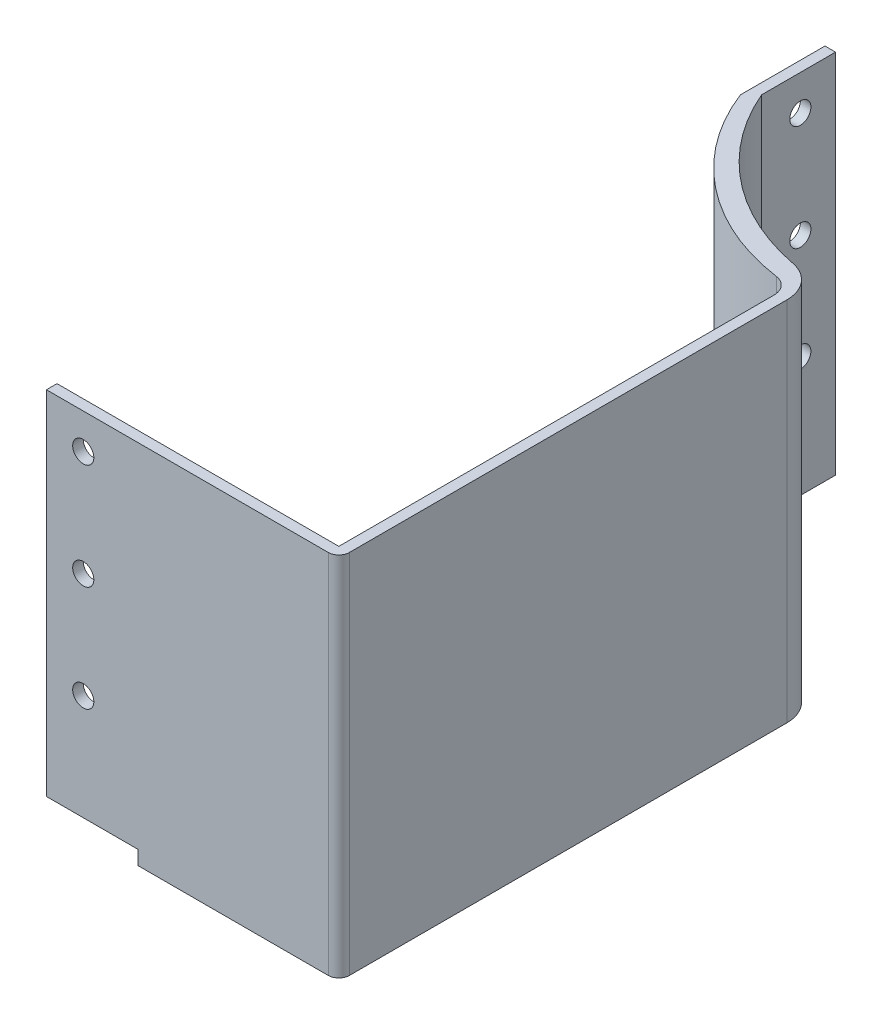
ISO-10303-21;
HEADER;
FILE_DESCRIPTION(('STEP AP214'),'2;1');
FILE_NAME('part.step','',(''),(''),'','','');
FILE_SCHEMA(('AUTOMOTIVE_DESIGN { 1 0 10303 214 1 1 1 1 }'));
ENDSEC;
DATA;
#1=APPLICATION_CONTEXT('core data for automotive mechanical design processes');
#2=APPLICATION_PROTOCOL_DEFINITION('international standard','automotive_design',2000,#1);
#3=PRODUCT_CONTEXT('',#1,'mechanical');
#4=PRODUCT('Part','Part','',(#3));
#5=PRODUCT_RELATED_PRODUCT_CATEGORY('part','',(#4));
#6=PRODUCT_DEFINITION_FORMATION('','',#4);
#7=PRODUCT_DEFINITION_CONTEXT('part definition',#1,'design');
#8=PRODUCT_DEFINITION('design','',#6,#7);
#9=PRODUCT_DEFINITION_SHAPE('','',#8);
#10=(LENGTH_UNIT() NAMED_UNIT(*) SI_UNIT(.MILLI.,.METRE.));
#11=(NAMED_UNIT(*) PLANE_ANGLE_UNIT() SI_UNIT($,.RADIAN.));
#12=(NAMED_UNIT(*) SI_UNIT($,.STERADIAN.) SOLID_ANGLE_UNIT());
#13=UNCERTAINTY_MEASURE_WITH_UNIT(LENGTH_MEASURE(1.E-05),#10,'distance_accuracy_value','');
#14=(GEOMETRIC_REPRESENTATION_CONTEXT(3) GLOBAL_UNCERTAINTY_ASSIGNED_CONTEXT((#13)) GLOBAL_UNIT_ASSIGNED_CONTEXT((#10,
#11,#12)) REPRESENTATION_CONTEXT('',''));
#15=CARTESIAN_POINT('',(0.,0.,0.));
#16=DIRECTION('',(0.,0.,1.));
#17=DIRECTION('',(1.,0.,0.));
#18=AXIS2_PLACEMENT_3D('',#15,#16,#17);
#19=CARTESIAN_POINT('',(58.5616033549649,-100.,-174.880780034734));
#20=DIRECTION('',(0.,1.,0.));
#21=DIRECTION('',(0.,0.,1.));
#22=AXIS2_PLACEMENT_3D('',#19,#20,#21);
#23=CYLINDRICAL_SURFACE('',#22,62.7741227806787);
#24=CARTESIAN_POINT('',(58.5616033549649,-100.,-174.880780034734));
#25=DIRECTION('',(0.,1.,0.));
#26=DIRECTION('',(0.,0.,-1.));
#27=AXIS2_PLACEMENT_3D('',#24,#25,#26);
#28=CIRCLE('',#27,62.7741227806787);
#29=CARTESIAN_POINT('',(0.,-100.,-152.272615505532));
#30=VERTEX_POINT('',#29);
#31=CARTESIAN_POINT('',(49.7054022215755,-100.,-112.734515526168));
#32=VERTEX_POINT('',#31);
#33=EDGE_CURVE('E237',#30,#32,#28,.T.);
#34=ORIENTED_EDGE('',*,*,#33,.T.);
#35=DIRECTION('',(0.,1.,0.));
#36=VECTOR('',#35,1.);
#37=CARTESIAN_POINT('',(49.7054022215755,-100.,-112.734515526168));
#38=LINE('',#37,#36);
#39=CARTESIAN_POINT('',(49.7054022215755,0.,-112.734515526168));
#40=VERTEX_POINT('',#39);
#41=EDGE_CURVE('E330',#32,#40,#38,.T.);
#42=ORIENTED_EDGE('',*,*,#41,.T.);
#43=CARTESIAN_POINT('',(58.5616033549649,0.,-174.880780034734));
#44=DIRECTION('',(0.,1.,0.));
#45=DIRECTION('',(0.,0.,-1.));
#46=AXIS2_PLACEMENT_3D('',#43,#44,#45);
#47=CIRCLE('',#46,62.7741227806787);
#48=CARTESIAN_POINT('',(0.,0.,-152.272615505532));
#49=VERTEX_POINT('',#48);
#50=EDGE_CURVE('E259',#49,#40,#47,.T.);
#51=ORIENTED_EDGE('',*,*,#50,.F.);
#52=DIRECTION('',(0.,1.,0.));
#53=VECTOR('',#52,1.);
#54=CARTESIAN_POINT('',(0.,-100.,-152.272615505532));
#55=LINE('',#54,#53);
#56=EDGE_CURVE('E153',#30,#49,#55,.T.);
#57=ORIENTED_EDGE('',*,*,#56,.F.);
#58=EDGE_LOOP('',(#34,#42,#51,#57));
#59=FACE_BOUND('',#58,.T.);
#60=ADVANCED_FACE('F39',(#59),#23,.T.);
#61=CARTESIAN_POINT('',(0.,-100.,-152.272615505532));
#62=DIRECTION('',(-1.,0.,0.));
#63=DIRECTION('',(0.,0.,1.));
#64=AXIS2_PLACEMENT_3D('',#61,#62,#63);
#65=PLANE('',#64);
#66=CARTESIAN_POINT('',(0.,-70.,-166.272615505532));
#67=DIRECTION('',(-1.,0.,0.));
#68=DIRECTION('',(0.,0.,1.));
#69=AXIS2_PLACEMENT_3D('',#66,#67,#68);
#70=CIRCLE('',#69,2.99999999999999);
#71=CARTESIAN_POINT('',(0.,-70.,-163.272615505532));
#72=VERTEX_POINT('',#71);
#73=EDGE_CURVE('E220',#72,#72,#70,.T.);
#74=ORIENTED_EDGE('',*,*,#73,.F.);
#75=EDGE_LOOP('',(#74));
#76=FACE_BOUND('',#75,.T.);
#77=CARTESIAN_POINT('',(0.,-40.,-166.272615505532));
#78=DIRECTION('',(-1.,0.,0.));
#79=DIRECTION('',(0.,0.,1.));
#80=AXIS2_PLACEMENT_3D('',#77,#78,#79);
#81=CIRCLE('',#80,2.99999999999999);
#82=CARTESIAN_POINT('',(0.,-40.,-163.272615505532));
#83=VERTEX_POINT('',#82);
#84=EDGE_CURVE('E216',#83,#83,#81,.T.);
#85=ORIENTED_EDGE('',*,*,#84,.F.);
#86=EDGE_LOOP('',(#85));
#87=FACE_BOUND('',#86,.T.);
#88=CARTESIAN_POINT('',(0.,-9.99999999999999,-166.272615505532));
#89=DIRECTION('',(-1.,0.,0.));
#90=DIRECTION('',(0.,0.,1.));
#91=AXIS2_PLACEMENT_3D('',#88,#89,#90);
#92=CIRCLE('',#91,2.99999999999999);
#93=CARTESIAN_POINT('',(0.,-9.99999999999999,-163.272615505532));
#94=VERTEX_POINT('',#93);
#95=EDGE_CURVE('E205',#94,#94,#92,.T.);
#96=ORIENTED_EDGE('',*,*,#95,.F.);
#97=EDGE_LOOP('',(#96));
#98=FACE_BOUND('',#97,.T.);
#99=DIRECTION('',(0.,0.,1.));
#100=VECTOR('',#99,1.);
#101=CARTESIAN_POINT('',(0.,0.,-152.272615505532));
#102=LINE('',#101,#100);
#103=CARTESIAN_POINT('',(0.,0.,-176.272615505532));
#104=VERTEX_POINT('',#103);
#105=EDGE_CURVE('E148',#104,#49,#102,.T.);
#106=ORIENTED_EDGE('',*,*,#105,.F.);
#107=DIRECTION('',(0.,1.,0.));
#108=VECTOR('',#107,1.);
#109=CARTESIAN_POINT('',(0.,-100.,-176.272615505532));
#110=LINE('',#109,#108);
#111=CARTESIAN_POINT('',(0.,-104.,-176.272615505532));
#112=VERTEX_POINT('',#111);
#113=EDGE_CURVE('E142',#112,#104,#110,.T.);
#114=ORIENTED_EDGE('',*,*,#113,.F.);
#115=DIRECTION('',(0.,0.,-1.));
#116=VECTOR('',#115,1.);
#117=CARTESIAN_POINT('',(0.,-104.,-176.272615505532));
#118=LINE('',#117,#116);
#119=CARTESIAN_POINT('',(0.,-104.,18.7273844944685));
#120=VERTEX_POINT('',#119);
#121=EDGE_CURVE('E146',#120,#112,#118,.T.);
#122=ORIENTED_EDGE('',*,*,#121,.F.);
#123=DIRECTION('',(0.,1.,0.));
#124=VECTOR('',#123,1.);
#125=CARTESIAN_POINT('',(0.,-104.,18.7273844944685));
#126=LINE('',#125,#124);
#127=CARTESIAN_POINT('',(0.,-100.,18.7273844944685));
#128=VERTEX_POINT('',#127);
#129=EDGE_CURVE('E196',#120,#128,#126,.T.);
#130=ORIENTED_EDGE('',*,*,#129,.T.);
#131=DIRECTION('',(0.,0.,-1.));
#132=VECTOR('',#131,1.);
#133=CARTESIAN_POINT('',(0.,-100.,-176.272615505532));
#134=LINE('',#133,#132);
#135=CARTESIAN_POINT('',(0.,-100.,15.7273844944684));
#136=VERTEX_POINT('',#135);
#137=EDGE_CURVE('E171',#128,#136,#134,.T.);
#138=ORIENTED_EDGE('',*,*,#137,.T.);
#139=EDGE_CURVE('E175',#136,#30,#134,.T.);
#140=ORIENTED_EDGE('',*,*,#139,.T.);
#141=ORIENTED_EDGE('',*,*,#56,.T.);
#142=EDGE_LOOP('',(#106,#114,#122,#130,#138,#140,#141));
#143=FACE_BOUND('',#142,.T.);
#144=ADVANCED_FACE('F144',(#76,#87,#98,#143),#65,.T.);
#145=CARTESIAN_POINT('',(0.,-100.,-176.272615505532));
#146=DIRECTION('',(0.,0.,-1.));
#147=DIRECTION('',(-1.,0.,0.));
#148=AXIS2_PLACEMENT_3D('',#145,#146,#147);
#149=PLANE('',#148);
#150=DIRECTION('',(-1.,0.,0.));
#151=VECTOR('',#150,1.);
#152=CARTESIAN_POINT('',(0.,0.,-176.272615505532));
#153=LINE('',#152,#151);
#154=CARTESIAN_POINT('',(3.,0.,-176.272615505532));
#155=VERTEX_POINT('',#154);
#156=EDGE_CURVE('E288',#155,#104,#153,.T.);
#157=ORIENTED_EDGE('',*,*,#156,.F.);
#158=DIRECTION('',(0.,1.,0.));
#159=VECTOR('',#158,1.);
#160=CARTESIAN_POINT('',(3.,-100.,-176.272615505532));
#161=LINE('',#160,#159);
#162=CARTESIAN_POINT('',(3.,-104.,-176.272615505532));
#163=VERTEX_POINT('',#162);
#164=EDGE_CURVE('E154',#163,#155,#161,.T.);
#165=ORIENTED_EDGE('',*,*,#164,.F.);
#166=DIRECTION('',(1.,0.,0.));
#167=VECTOR('',#166,1.);
#168=CARTESIAN_POINT('',(3.,-104.,-176.272615505532));
#169=LINE('',#168,#167);
#170=EDGE_CURVE('E157',#112,#163,#169,.T.);
#171=ORIENTED_EDGE('',*,*,#170,.F.);
#172=ORIENTED_EDGE('',*,*,#113,.T.);
#173=EDGE_LOOP('',(#157,#165,#171,#172));
#174=FACE_BOUND('',#173,.T.);
#175=ADVANCED_FACE('F158',(#174),#149,.T.);
#176=CARTESIAN_POINT('',(3.,-100.,-176.272615505532));
#177=DIRECTION('',(1.,0.,0.));
#178=DIRECTION('',(0.,0.,-1.));
#179=AXIS2_PLACEMENT_3D('',#176,#177,#178);
#180=PLANE('',#179);
#181=CARTESIAN_POINT('',(3.,-70.,-166.272615505532));
#182=DIRECTION('',(1.,0.,0.));
#183=DIRECTION('',(0.,0.,-1.));
#184=AXIS2_PLACEMENT_3D('',#181,#182,#183);
#185=CIRCLE('',#184,2.99999999999999);
#186=CARTESIAN_POINT('',(3.,-70.,-169.272615505532));
#187=VERTEX_POINT('',#186);
#188=EDGE_CURVE('E201',#187,#187,#185,.T.);
#189=ORIENTED_EDGE('',*,*,#188,.F.);
#190=EDGE_LOOP('',(#189));
#191=FACE_BOUND('',#190,.T.);
#192=CARTESIAN_POINT('',(3.,-40.,-166.272615505532));
#193=DIRECTION('',(1.,0.,0.));
#194=DIRECTION('',(0.,0.,-1.));
#195=AXIS2_PLACEMENT_3D('',#192,#193,#194);
#196=CIRCLE('',#195,2.99999999999999);
#197=CARTESIAN_POINT('',(3.,-40.,-169.272615505532));
#198=VERTEX_POINT('',#197);
#199=EDGE_CURVE('E206',#198,#198,#196,.T.);
#200=ORIENTED_EDGE('',*,*,#199,.F.);
#201=EDGE_LOOP('',(#200));
#202=FACE_BOUND('',#201,.T.);
#203=CARTESIAN_POINT('',(3.,-9.99999999999999,-166.272615505532));
#204=DIRECTION('',(1.,0.,0.));
#205=DIRECTION('',(0.,0.,-1.));
#206=AXIS2_PLACEMENT_3D('',#203,#204,#205);
#207=CIRCLE('',#206,2.99999999999999);
#208=CARTESIAN_POINT('',(3.,-9.99999999999999,-169.272615505532));
#209=VERTEX_POINT('',#208);
#210=EDGE_CURVE('E200',#209,#209,#207,.T.);
#211=ORIENTED_EDGE('',*,*,#210,.F.);
#212=EDGE_LOOP('',(#211));
#213=FACE_BOUND('',#212,.T.);
#214=DIRECTION('',(0.,0.,-1.));
#215=VECTOR('',#214,1.);
#216=CARTESIAN_POINT('',(3.,0.,-176.272615505532));
#217=LINE('',#216,#215);
#218=CARTESIAN_POINT('',(3.,0.,-155.272615505532));
#219=VERTEX_POINT('',#218);
#220=EDGE_CURVE('E284',#219,#155,#217,.T.);
#221=ORIENTED_EDGE('',*,*,#220,.F.);
#222=DIRECTION('',(0.,1.,0.));
#223=VECTOR('',#222,1.);
#224=CARTESIAN_POINT('',(3.,-100.,-155.272615505532));
#225=LINE('',#224,#223);
#226=CARTESIAN_POINT('',(3.,-104.,-155.272615505532));
#227=VERTEX_POINT('',#226);
#228=EDGE_CURVE('E298',#227,#219,#225,.T.);
#229=ORIENTED_EDGE('',*,*,#228,.F.);
#230=DIRECTION('',(0.,0.,1.));
#231=VECTOR('',#230,1.);
#232=CARTESIAN_POINT('',(3.,-104.,-155.272615505532));
#233=LINE('',#232,#231);
#234=EDGE_CURVE('E163',#163,#227,#233,.T.);
#235=ORIENTED_EDGE('',*,*,#234,.F.);
#236=ORIENTED_EDGE('',*,*,#164,.T.);
#237=EDGE_LOOP('',(#221,#229,#235,#236));
#238=FACE_BOUND('',#237,.T.);
#239=ADVANCED_FACE('F379',(#191,#202,#213,#238),#180,.T.);
#240=CARTESIAN_POINT('',(60.7261232311468,-100.,-179.936053781372));
#241=DIRECTION('',(0.,1.,0.));
#242=DIRECTION('',(0.,0.,1.));
#243=AXIS2_PLACEMENT_3D('',#240,#241,#242);
#244=CYLINDRICAL_SURFACE('',#243,62.7741227806788);
#245=CARTESIAN_POINT('',(60.7261232311468,0.,-179.936053781372));
#246=DIRECTION('',(0.,-1.,0.));
#247=DIRECTION('',(0.,0.,-1.));
#248=AXIS2_PLACEMENT_3D('',#245,#246,#247);
#249=CIRCLE('',#248,62.7741227806788);
#250=CARTESIAN_POINT('',(48.8861269235101,0.,-118.288629031275));
#251=VERTEX_POINT('',#250);
#252=EDGE_CURVE('E281',#251,#219,#249,.T.);
#253=ORIENTED_EDGE('',*,*,#252,.F.);
#254=DIRECTION('',(0.,1.,0.));
#255=VECTOR('',#254,1.);
#256=CARTESIAN_POINT('',(48.8861269235101,-100.,-118.288629031275));
#257=LINE('',#256,#255);
#258=CARTESIAN_POINT('',(48.8861269235101,-104.,-118.288629031275));
#259=VERTEX_POINT('',#258);
#260=EDGE_CURVE('E317',#251,#259,#257,.F.);
#261=ORIENTED_EDGE('',*,*,#260,.T.);
#262=CARTESIAN_POINT('',(60.7261232311468,-104.,-179.936053781372));
#263=DIRECTION('',(0.,1.,0.));
#264=DIRECTION('',(0.,0.,1.));
#265=AXIS2_PLACEMENT_3D('',#262,#263,#264);
#266=CIRCLE('',#265,62.7741227806788);
#267=EDGE_CURVE('E180',#227,#259,#266,.T.);
#268=ORIENTED_EDGE('',*,*,#267,.F.);
#269=ORIENTED_EDGE('',*,*,#228,.T.);
#270=EDGE_LOOP('',(#253,#261,#268,#269));
#271=FACE_BOUND('',#270,.T.);
#272=ADVANCED_FACE('F383',(#271),#244,.F.);
#273=CARTESIAN_POINT('',(57.,-100.,-117.272615505532));
#274=DIRECTION('',(1.,0.,0.));
#275=DIRECTION('',(0.,0.,-1.));
#276=AXIS2_PLACEMENT_3D('',#273,#274,#275);
#277=PLANE('',#276);
#278=DIRECTION('',(0.,0.,-1.));
#279=VECTOR('',#278,1.);
#280=CARTESIAN_POINT('',(57.,0.,-117.272615505532));
#281=LINE('',#280,#279);
#282=CARTESIAN_POINT('',(57.,0.,15.7273844944684));
#283=VERTEX_POINT('',#282);
#284=CARTESIAN_POINT('',(57.,0.,-108.468113503645));
#285=VERTEX_POINT('',#284);
#286=EDGE_CURVE('E278',#283,#285,#281,.T.);
#287=ORIENTED_EDGE('',*,*,#286,.F.);
#288=DIRECTION('',(0.,1.,0.));
#289=VECTOR('',#288,1.);
#290=CARTESIAN_POINT('',(57.,-100.,15.7273844944684));
#291=LINE('',#290,#289);
#292=CARTESIAN_POINT('',(57.,-104.,15.7273844944684));
#293=VERTEX_POINT('',#292);
#294=EDGE_CURVE('E327',#283,#293,#291,.F.);
#295=ORIENTED_EDGE('',*,*,#294,.T.);
#296=DIRECTION('',(0.,0.,1.));
#297=VECTOR('',#296,1.);
#298=CARTESIAN_POINT('',(57.,-104.,15.7273844944684));
#299=LINE('',#298,#297);
#300=CARTESIAN_POINT('',(57.,-104.,-108.468113503645));
#301=VERTEX_POINT('',#300);
#302=EDGE_CURVE('E188',#301,#293,#299,.T.);
#303=ORIENTED_EDGE('',*,*,#302,.F.);
#304=DIRECTION('',(0.,1.,0.));
#305=VECTOR('',#304,1.);
#306=CARTESIAN_POINT('',(57.,-100.,-108.468113503645));
#307=LINE('',#306,#305);
#308=EDGE_CURVE('E294',#301,#285,#307,.T.);
#309=ORIENTED_EDGE('',*,*,#308,.T.);
#310=EDGE_LOOP('',(#287,#295,#303,#309));
#311=FACE_BOUND('',#310,.T.);
#312=ADVANCED_FACE('F392',(#311),#277,.T.);
#313=CARTESIAN_POINT('',(57.,-100.,18.7273844944684));
#314=DIRECTION('',(0.,0.,1.));
#315=DIRECTION('',(1.,0.,0.));
#316=AXIS2_PLACEMENT_3D('',#313,#314,#315);
#317=PLANE('',#316);
#318=CARTESIAN_POINT('',(-15.5536016769738,-10.,18.7273844944685));
#319=DIRECTION('',(0.,0.,1.));
#320=DIRECTION('',(1.,0.,0.));
#321=AXIS2_PLACEMENT_3D('',#318,#319,#320);
#322=CIRCLE('',#321,3.00000000000001);
#323=CARTESIAN_POINT('',(-12.5536016769737,-10.,18.7273844944685));
#324=VERTEX_POINT('',#323);
#325=EDGE_CURVE('E225',#324,#324,#322,.T.);
#326=ORIENTED_EDGE('',*,*,#325,.F.);
#327=EDGE_LOOP('',(#326));
#328=FACE_BOUND('',#327,.T.);
#329=CARTESIAN_POINT('',(-15.5536016769734,-40.,18.7273844944685));
#330=DIRECTION('',(0.,0.,1.));
#331=DIRECTION('',(1.,0.,0.));
#332=AXIS2_PLACEMENT_3D('',#329,#330,#331);
#333=CIRCLE('',#332,3.00000000000001);
#334=CARTESIAN_POINT('',(-12.5536016769734,-40.,18.7273844944685));
#335=VERTEX_POINT('',#334);
#336=EDGE_CURVE('E230',#335,#335,#333,.T.);
#337=ORIENTED_EDGE('',*,*,#336,.F.);
#338=EDGE_LOOP('',(#337));
#339=FACE_BOUND('',#338,.T.);
#340=CARTESIAN_POINT('',(-15.5536016769731,-70.,18.7273844944685));
#341=DIRECTION('',(0.,0.,1.));
#342=DIRECTION('',(1.,0.,0.));
#343=AXIS2_PLACEMENT_3D('',#340,#341,#342);
#344=CIRCLE('',#343,3.00000000000001);
#345=CARTESIAN_POINT('',(-12.5536016769731,-70.,18.7273844944685));
#346=VERTEX_POINT('',#345);
#347=EDGE_CURVE('E224',#346,#346,#344,.T.);
#348=ORIENTED_EDGE('',*,*,#347,.F.);
#349=EDGE_LOOP('',(#348));
#350=FACE_BOUND('',#349,.T.);
#351=DIRECTION('',(1.,0.,0.));
#352=VECTOR('',#351,1.);
#353=CARTESIAN_POINT('',(57.,-100.,18.7273844944684));
#354=LINE('',#353,#352);
#355=CARTESIAN_POINT('',(-26.,-100.,18.7273844944685));
#356=VERTEX_POINT('',#355);
#357=EDGE_CURVE('E254',#356,#128,#354,.T.);
#358=ORIENTED_EDGE('',*,*,#357,.T.);
#359=ORIENTED_EDGE('',*,*,#129,.F.);
#360=DIRECTION('',(-1.,0.,0.));
#361=VECTOR('',#360,1.);
#362=CARTESIAN_POINT('',(0.,-104.,18.7273844944685));
#363=LINE('',#362,#361);
#364=CARTESIAN_POINT('',(54.,-104.,18.7273844944685));
#365=VERTEX_POINT('',#364);
#366=EDGE_CURVE('E168',#365,#120,#363,.T.);
#367=ORIENTED_EDGE('',*,*,#366,.F.);
#368=DIRECTION('',(0.,1.,0.));
#369=VECTOR('',#368,1.);
#370=CARTESIAN_POINT('',(54.,-100.,18.7273844944684));
#371=LINE('',#370,#369);
#372=CARTESIAN_POINT('',(54.,0.,18.7273844944684));
#373=VERTEX_POINT('',#372);
#374=EDGE_CURVE('E320',#365,#373,#371,.T.);
#375=ORIENTED_EDGE('',*,*,#374,.T.);
#376=DIRECTION('',(1.,0.,0.));
#377=VECTOR('',#376,1.);
#378=CARTESIAN_POINT('',(57.,0.,18.7273844944684));
#379=LINE('',#378,#377);
#380=CARTESIAN_POINT('',(-26.,0.,18.7273844944685));
#381=VERTEX_POINT('',#380);
#382=EDGE_CURVE('E274',#381,#373,#379,.T.);
#383=ORIENTED_EDGE('',*,*,#382,.F.);
#384=DIRECTION('',(0.,1.,0.));
#385=VECTOR('',#384,1.);
#386=CARTESIAN_POINT('',(-26.,-100.,18.7273844944685));
#387=LINE('',#386,#385);
#388=EDGE_CURVE('E302',#356,#381,#387,.T.);
#389=ORIENTED_EDGE('',*,*,#388,.F.);
#390=EDGE_LOOP('',(#358,#359,#367,#375,#383,#389));
#391=FACE_BOUND('',#390,.T.);
#392=ADVANCED_FACE('F363',(#328,#339,#350,#391),#317,.T.);
#393=CARTESIAN_POINT('',(-26.,-100.,18.7273844944685));
#394=DIRECTION('',(-1.,0.,0.));
#395=DIRECTION('',(0.,0.,1.));
#396=AXIS2_PLACEMENT_3D('',#393,#394,#395);
#397=PLANE('',#396);
#398=DIRECTION('',(0.,0.,1.));
#399=VECTOR('',#398,1.);
#400=CARTESIAN_POINT('',(-26.,0.,18.7273844944685));
#401=LINE('',#400,#399);
#402=CARTESIAN_POINT('',(-26.,0.,15.7273844944684));
#403=VERTEX_POINT('',#402);
#404=EDGE_CURVE('E270',#403,#381,#401,.T.);
#405=ORIENTED_EDGE('',*,*,#404,.F.);
#406=DIRECTION('',(0.,1.,0.));
#407=VECTOR('',#406,1.);
#408=CARTESIAN_POINT('',(-26.,-100.,15.7273844944684));
#409=LINE('',#408,#407);
#410=CARTESIAN_POINT('',(-26.,-100.,15.7273844944684));
#411=VERTEX_POINT('',#410);
#412=EDGE_CURVE('E305',#411,#403,#409,.T.);
#413=ORIENTED_EDGE('',*,*,#412,.F.);
#414=DIRECTION('',(0.,0.,1.));
#415=VECTOR('',#414,1.);
#416=CARTESIAN_POINT('',(-26.,-100.,18.7273844944685));
#417=LINE('',#416,#415);
#418=EDGE_CURVE('E250',#411,#356,#417,.T.);
#419=ORIENTED_EDGE('',*,*,#418,.T.);
#420=ORIENTED_EDGE('',*,*,#388,.T.);
#421=EDGE_LOOP('',(#405,#413,#419,#420));
#422=FACE_BOUND('',#421,.T.);
#423=ADVANCED_FACE('F359',(#422),#397,.T.);
#424=CARTESIAN_POINT('',(-26.,-100.,15.7273844944684));
#425=DIRECTION('',(0.,0.,-1.));
#426=DIRECTION('',(-1.,0.,0.));
#427=AXIS2_PLACEMENT_3D('',#424,#425,#426);
#428=PLANE('',#427);
#429=CARTESIAN_POINT('',(-15.5536016769738,-10.,15.7273844944684));
#430=DIRECTION('',(0.,0.,-1.));
#431=DIRECTION('',(-1.,0.,0.));
#432=AXIS2_PLACEMENT_3D('',#429,#430,#431);
#433=CIRCLE('',#432,3.00000000000001);
#434=CARTESIAN_POINT('',(-18.5536016769738,-10.,15.7273844944684));
#435=VERTEX_POINT('',#434);
#436=EDGE_CURVE('E263',#435,#435,#433,.T.);
#437=ORIENTED_EDGE('',*,*,#436,.F.);
#438=EDGE_LOOP('',(#437));
#439=FACE_BOUND('',#438,.T.);
#440=CARTESIAN_POINT('',(-15.5536016769734,-40.,15.7273844944684));
#441=DIRECTION('',(0.,0.,-1.));
#442=DIRECTION('',(-1.,0.,0.));
#443=AXIS2_PLACEMENT_3D('',#440,#441,#442);
#444=CIRCLE('',#443,3.00000000000001);
#445=CARTESIAN_POINT('',(-18.5536016769735,-40.,15.7273844944684));
#446=VERTEX_POINT('',#445);
#447=EDGE_CURVE('E334',#446,#446,#444,.T.);
#448=ORIENTED_EDGE('',*,*,#447,.F.);
#449=EDGE_LOOP('',(#448));
#450=FACE_BOUND('',#449,.T.);
#451=CARTESIAN_POINT('',(-15.5536016769731,-70.,15.7273844944684));
#452=DIRECTION('',(0.,0.,-1.));
#453=DIRECTION('',(-1.,0.,0.));
#454=AXIS2_PLACEMENT_3D('',#451,#452,#453);
#455=CIRCLE('',#454,3.00000000000001);
#456=CARTESIAN_POINT('',(-18.5536016769731,-70.,15.7273844944684));
#457=VERTEX_POINT('',#456);
#458=EDGE_CURVE('E229',#457,#457,#455,.T.);
#459=ORIENTED_EDGE('',*,*,#458,.F.);
#460=EDGE_LOOP('',(#459));
#461=FACE_BOUND('',#460,.T.);
#462=DIRECTION('',(-1.,0.,0.));
#463=VECTOR('',#462,1.);
#464=CARTESIAN_POINT('',(-26.,0.,15.7273844944684));
#465=LINE('',#464,#463);
#466=CARTESIAN_POINT('',(54.,0.,15.7273844944684));
#467=VERTEX_POINT('',#466);
#468=EDGE_CURVE('E266',#467,#403,#465,.T.);
#469=ORIENTED_EDGE('',*,*,#468,.F.);
#470=DIRECTION('',(0.,1.,0.));
#471=VECTOR('',#470,1.);
#472=CARTESIAN_POINT('',(54.,-100.,15.7273844944684));
#473=LINE('',#472,#471);
#474=CARTESIAN_POINT('',(54.,-100.,15.7273844944684));
#475=VERTEX_POINT('',#474);
#476=EDGE_CURVE('E258',#475,#467,#473,.T.);
#477=ORIENTED_EDGE('',*,*,#476,.F.);
#478=DIRECTION('',(-1.,0.,0.));
#479=VECTOR('',#478,1.);
#480=CARTESIAN_POINT('',(-26.,-100.,15.7273844944684));
#481=LINE('',#480,#479);
#482=EDGE_CURVE('E246',#475,#136,#481,.T.);
#483=ORIENTED_EDGE('',*,*,#482,.T.);
#484=EDGE_CURVE('E245',#136,#411,#481,.T.);
#485=ORIENTED_EDGE('',*,*,#484,.T.);
#486=ORIENTED_EDGE('',*,*,#412,.T.);
#487=EDGE_LOOP('',(#469,#477,#483,#485,#486));
#488=FACE_BOUND('',#487,.T.);
#489=ADVANCED_FACE('F352',(#439,#450,#461,#488),#428,.T.);
#490=CARTESIAN_POINT('',(54.,-100.,15.7273844944684));
#491=DIRECTION('',(-1.,0.,0.));
#492=DIRECTION('',(0.,0.,1.));
#493=AXIS2_PLACEMENT_3D('',#490,#491,#492);
#494=PLANE('',#493);
#495=DIRECTION('',(0.,0.,1.));
#496=VECTOR('',#495,1.);
#497=CARTESIAN_POINT('',(54.,0.,15.7273844944684));
#498=LINE('',#497,#496);
#499=CARTESIAN_POINT('',(54.,0.,-107.784524848824));
#500=VERTEX_POINT('',#499);
#501=EDGE_CURVE('E262',#500,#467,#498,.T.);
#502=ORIENTED_EDGE('',*,*,#501,.F.);
#503=DIRECTION('',(0.,-1.,0.));
#504=VECTOR('',#503,1.);
#505=CARTESIAN_POINT('',(54.,-100.,-107.784524848824));
#506=LINE('',#505,#504);
#507=CARTESIAN_POINT('',(54.,-100.,-107.784524848824));
#508=VERTEX_POINT('',#507);
#509=EDGE_CURVE('E343',#500,#508,#506,.T.);
#510=ORIENTED_EDGE('',*,*,#509,.T.);
#511=DIRECTION('',(0.,0.,1.));
#512=VECTOR('',#511,1.);
#513=CARTESIAN_POINT('',(54.,-100.,15.7273844944684));
#514=LINE('',#513,#512);
#515=EDGE_CURVE('E241',#508,#475,#514,.T.);
#516=ORIENTED_EDGE('',*,*,#515,.T.);
#517=ORIENTED_EDGE('',*,*,#476,.T.);
#518=EDGE_LOOP('',(#502,#510,#516,#517));
#519=FACE_BOUND('',#518,.T.);
#520=ADVANCED_FACE('F367',(#519),#494,.T.);
#521=CARTESIAN_POINT('',(58.5616033549649,-100.,-174.880780034734));
#522=DIRECTION('',(0.,-1.,0.));
#523=DIRECTION('',(0.,0.,-1.));
#524=AXIS2_PLACEMENT_3D('',#521,#522,#523);
#525=PLANE('',#524);
#526=ORIENTED_EDGE('',*,*,#137,.F.);
#527=ORIENTED_EDGE('',*,*,#357,.F.);
#528=ORIENTED_EDGE('',*,*,#418,.F.);
#529=ORIENTED_EDGE('',*,*,#484,.F.);
#530=EDGE_LOOP('',(#526,#527,#528,#529));
#531=FACE_BOUND('',#530,.T.);
#532=ADVANCED_FACE('F361',(#531),#525,.T.);
#533=CARTESIAN_POINT('',(58.5616033549649,0.,-174.880780034734));
#534=DIRECTION('',(0.,-1.,0.));
#535=DIRECTION('',(0.,0.,-1.));
#536=AXIS2_PLACEMENT_3D('',#533,#534,#535);
#537=PLANE('',#536);
#538=ORIENTED_EDGE('',*,*,#382,.T.);
#539=CARTESIAN_POINT('',(54.,0.,15.7273844944684));
#540=DIRECTION('',(0.,-1.,0.));
#541=DIRECTION('',(0.,0.,-1.));
#542=AXIS2_PLACEMENT_3D('',#539,#540,#541);
#543=CIRCLE('',#542,3.);
#544=EDGE_CURVE('E324',#373,#283,#543,.F.);
#545=ORIENTED_EDGE('',*,*,#544,.T.);
#546=ORIENTED_EDGE('',*,*,#286,.T.);
#547=CARTESIAN_POINT('',(47.,0.,-108.468113503645));
#548=DIRECTION('',(0.,-1.,0.));
#549=DIRECTION('',(0.,0.,-1.));
#550=AXIS2_PLACEMENT_3D('',#547,#548,#549);
#551=CIRCLE('',#550,10.);
#552=EDGE_CURVE('E314',#285,#251,#551,.F.);
#553=ORIENTED_EDGE('',*,*,#552,.T.);
#554=ORIENTED_EDGE('',*,*,#252,.T.);
#555=ORIENTED_EDGE('',*,*,#220,.T.);
#556=ORIENTED_EDGE('',*,*,#156,.T.);
#557=ORIENTED_EDGE('',*,*,#105,.T.);
#558=ORIENTED_EDGE('',*,*,#50,.T.);
#559=CARTESIAN_POINT('',(49.,0.,-107.784524848824));
#560=DIRECTION('',(0.,-1.,0.));
#561=DIRECTION('',(0.,0.,-1.));
#562=AXIS2_PLACEMENT_3D('',#559,#560,#561);
#563=CIRCLE('',#562,5.);
#564=EDGE_CURVE('E48',#40,#500,#563,.T.);
#565=ORIENTED_EDGE('',*,*,#564,.T.);
#566=ORIENTED_EDGE('',*,*,#501,.T.);
#567=ORIENTED_EDGE('',*,*,#468,.T.);
#568=ORIENTED_EDGE('',*,*,#404,.T.);
#569=EDGE_LOOP('',(#538,#545,#546,#553,#554,#555,#556,#557,#558,#565,#566,#567,#568));
#570=FACE_BOUND('',#569,.T.);
#571=ADVANCED_FACE('F365',(#570),#537,.F.);
#572=CARTESIAN_POINT('',(47.,-100.,-108.468113503645));
#573=DIRECTION('',(0.,1.,0.));
#574=DIRECTION('',(0.,0.,1.));
#575=AXIS2_PLACEMENT_3D('',#572,#573,#574);
#576=CYLINDRICAL_SURFACE('',#575,10.);
#577=ORIENTED_EDGE('',*,*,#308,.F.);
#578=CARTESIAN_POINT('',(47.,-104.,-108.468113503645));
#579=DIRECTION('',(0.,-1.,0.));
#580=DIRECTION('',(0.,0.,1.));
#581=AXIS2_PLACEMENT_3D('',#578,#579,#580);
#582=CIRCLE('',#581,10.);
#583=EDGE_CURVE('E184',#259,#301,#582,.T.);
#584=ORIENTED_EDGE('',*,*,#583,.F.);
#585=ORIENTED_EDGE('',*,*,#260,.F.);
#586=ORIENTED_EDGE('',*,*,#552,.F.);
#587=EDGE_LOOP('',(#577,#584,#585,#586));
#588=FACE_BOUND('',#587,.T.);
#589=ADVANCED_FACE('F387',(#588),#576,.T.);
#590=CARTESIAN_POINT('',(54.,-100.,15.7273844944684));
#591=DIRECTION('',(0.,1.,0.));
#592=DIRECTION('',(0.,0.,1.));
#593=AXIS2_PLACEMENT_3D('',#590,#591,#592);
#594=CYLINDRICAL_SURFACE('',#593,3.);
#595=ORIENTED_EDGE('',*,*,#374,.F.);
#596=CARTESIAN_POINT('',(54.,-104.,15.7273844944684));
#597=DIRECTION('',(0.,-1.,0.));
#598=DIRECTION('',(0.,0.,1.));
#599=AXIS2_PLACEMENT_3D('',#596,#597,#598);
#600=CIRCLE('',#599,3.);
#601=EDGE_CURVE('E192',#293,#365,#600,.T.);
#602=ORIENTED_EDGE('',*,*,#601,.F.);
#603=ORIENTED_EDGE('',*,*,#294,.F.);
#604=ORIENTED_EDGE('',*,*,#544,.F.);
#605=EDGE_LOOP('',(#595,#602,#603,#604));
#606=FACE_BOUND('',#605,.T.);
#607=ADVANCED_FACE('F395',(#606),#594,.T.);
#608=CARTESIAN_POINT('',(-15.5536016769731,-70.,-41.2726155055315));
#609=DIRECTION('',(0.,0.,1.));
#610=DIRECTION('',(1.,0.,0.));
#611=AXIS2_PLACEMENT_3D('',#608,#609,#610);
#612=CYLINDRICAL_SURFACE('',#611,3.00000000000001);
#613=ORIENTED_EDGE('',*,*,#458,.T.);
#614=EDGE_LOOP('',(#613));
#615=FACE_BOUND('',#614,.T.);
#616=ORIENTED_EDGE('',*,*,#347,.T.);
#617=EDGE_LOOP('',(#616));
#618=FACE_BOUND('',#617,.T.);
#619=ADVANCED_FACE('F397',(#615,#618),#612,.F.);
#620=CARTESIAN_POINT('',(-15.5536016769734,-40.,-41.2726155055315));
#621=DIRECTION('',(0.,0.,1.));
#622=DIRECTION('',(1.,0.,0.));
#623=AXIS2_PLACEMENT_3D('',#620,#621,#622);
#624=CYLINDRICAL_SURFACE('',#623,3.00000000000001);
#625=ORIENTED_EDGE('',*,*,#447,.T.);
#626=EDGE_LOOP('',(#625));
#627=FACE_BOUND('',#626,.T.);
#628=ORIENTED_EDGE('',*,*,#336,.T.);
#629=EDGE_LOOP('',(#628));
#630=FACE_BOUND('',#629,.T.);
#631=ADVANCED_FACE('F402',(#627,#630),#624,.F.);
#632=CARTESIAN_POINT('',(-15.5536016769738,-10.,-41.2726155055315));
#633=DIRECTION('',(0.,0.,1.));
#634=DIRECTION('',(1.,0.,0.));
#635=AXIS2_PLACEMENT_3D('',#632,#633,#634);
#636=CYLINDRICAL_SURFACE('',#635,3.00000000000001);
#637=ORIENTED_EDGE('',*,*,#436,.T.);
#638=EDGE_LOOP('',(#637));
#639=FACE_BOUND('',#638,.T.);
#640=ORIENTED_EDGE('',*,*,#325,.T.);
#641=EDGE_LOOP('',(#640));
#642=FACE_BOUND('',#641,.T.);
#643=ADVANCED_FACE('F439',(#639,#642),#636,.F.);
#644=CARTESIAN_POINT('',(-57.,-9.99999999999999,-166.272615505532));
#645=DIRECTION('',(1.,0.,0.));
#646=DIRECTION('',(0.,0.,-1.));
#647=AXIS2_PLACEMENT_3D('',#644,#645,#646);
#648=CYLINDRICAL_SURFACE('',#647,2.99999999999999);
#649=ORIENTED_EDGE('',*,*,#95,.T.);
#650=EDGE_LOOP('',(#649));
#651=FACE_BOUND('',#650,.T.);
#652=ORIENTED_EDGE('',*,*,#210,.T.);
#653=EDGE_LOOP('',(#652));
#654=FACE_BOUND('',#653,.T.);
#655=ADVANCED_FACE('F443',(#651,#654),#648,.F.);
#656=CARTESIAN_POINT('',(-57.,-40.,-166.272615505532));
#657=DIRECTION('',(1.,0.,0.));
#658=DIRECTION('',(0.,0.,-1.));
#659=AXIS2_PLACEMENT_3D('',#656,#657,#658);
#660=CYLINDRICAL_SURFACE('',#659,2.99999999999999);
#661=ORIENTED_EDGE('',*,*,#84,.T.);
#662=EDGE_LOOP('',(#661));
#663=FACE_BOUND('',#662,.T.);
#664=ORIENTED_EDGE('',*,*,#199,.T.);
#665=EDGE_LOOP('',(#664));
#666=FACE_BOUND('',#665,.T.);
#667=ADVANCED_FACE('F447',(#663,#666),#660,.F.);
#668=CARTESIAN_POINT('',(-57.,-70.,-166.272615505532));
#669=DIRECTION('',(1.,0.,0.));
#670=DIRECTION('',(0.,0.,-1.));
#671=AXIS2_PLACEMENT_3D('',#668,#669,#670);
#672=CYLINDRICAL_SURFACE('',#671,2.99999999999999);
#673=ORIENTED_EDGE('',*,*,#73,.T.);
#674=EDGE_LOOP('',(#673));
#675=FACE_BOUND('',#674,.T.);
#676=ORIENTED_EDGE('',*,*,#188,.T.);
#677=EDGE_LOOP('',(#676));
#678=FACE_BOUND('',#677,.T.);
#679=ADVANCED_FACE('F451',(#675,#678),#672,.F.);
#680=CARTESIAN_POINT('',(49.,-100.,-107.784524848824));
#681=DIRECTION('',(0.,1.,0.));
#682=DIRECTION('',(0.,0.,1.));
#683=AXIS2_PLACEMENT_3D('',#680,#681,#682);
#684=CYLINDRICAL_SURFACE('',#683,5.);
#685=CARTESIAN_POINT('',(49.,-100.,-107.784524848824));
#686=DIRECTION('',(0.,-1.,0.));
#687=DIRECTION('',(0.,0.,-1.));
#688=AXIS2_PLACEMENT_3D('',#685,#686,#687);
#689=CIRCLE('',#688,5.);
#690=EDGE_CURVE('E11',#508,#32,#689,.F.);
#691=ORIENTED_EDGE('',*,*,#690,.F.);
#692=ORIENTED_EDGE('',*,*,#509,.F.);
#693=ORIENTED_EDGE('',*,*,#564,.F.);
#694=ORIENTED_EDGE('',*,*,#41,.F.);
#695=EDGE_LOOP('',(#691,#692,#693,#694));
#696=FACE_BOUND('',#695,.T.);
#697=ADVANCED_FACE('F41',(#696),#684,.F.);
#698=CARTESIAN_POINT('',(54.,-100.,15.7273844944684));
#699=DIRECTION('',(0.,1.,0.));
#700=DIRECTION('',(0.,0.,1.));
#701=AXIS2_PLACEMENT_3D('',#698,#699,#700);
#702=PLANE('',#701);
#703=ORIENTED_EDGE('',*,*,#482,.F.);
#704=ORIENTED_EDGE('',*,*,#515,.F.);
#705=ORIENTED_EDGE('',*,*,#690,.T.);
#706=ORIENTED_EDGE('',*,*,#33,.F.);
#707=ORIENTED_EDGE('',*,*,#139,.F.);
#708=EDGE_LOOP('',(#703,#704,#705,#706,#707));
#709=FACE_BOUND('',#708,.T.);
#710=ADVANCED_FACE('F370',(#709),#702,.T.);
#711=CARTESIAN_POINT('',(54.,-104.,15.7273844944684));
#712=DIRECTION('',(0.,1.,0.));
#713=DIRECTION('',(0.,0.,1.));
#714=AXIS2_PLACEMENT_3D('',#711,#712,#713);
#715=PLANE('',#714);
#716=ORIENTED_EDGE('',*,*,#121,.T.);
#717=ORIENTED_EDGE('',*,*,#170,.T.);
#718=ORIENTED_EDGE('',*,*,#234,.T.);
#719=ORIENTED_EDGE('',*,*,#267,.T.);
#720=ORIENTED_EDGE('',*,*,#583,.T.);
#721=ORIENTED_EDGE('',*,*,#302,.T.);
#722=ORIENTED_EDGE('',*,*,#601,.T.);
#723=ORIENTED_EDGE('',*,*,#366,.T.);
#724=EDGE_LOOP('',(#716,#717,#718,#719,#720,#721,#722,#723));
#725=FACE_BOUND('',#724,.T.);
#726=ADVANCED_FACE('F165',(#725),#715,.F.);
#727=CLOSED_SHELL('',(#60,#144,#175,#239,#272,#312,#392,#423,#489,#520,#532,#571,#589,#607,#619,
#631,#643,#655,#667,#679,#697,#710,#726));
#728=MANIFOLD_SOLID_BREP('B2',#727);
#729=ADVANCED_BREP_SHAPE_REPRESENTATION('',(#18,#728),#14);
#730=SHAPE_DEFINITION_REPRESENTATION(#9,#729);
ENDSEC;
END-ISO-10303-21;
